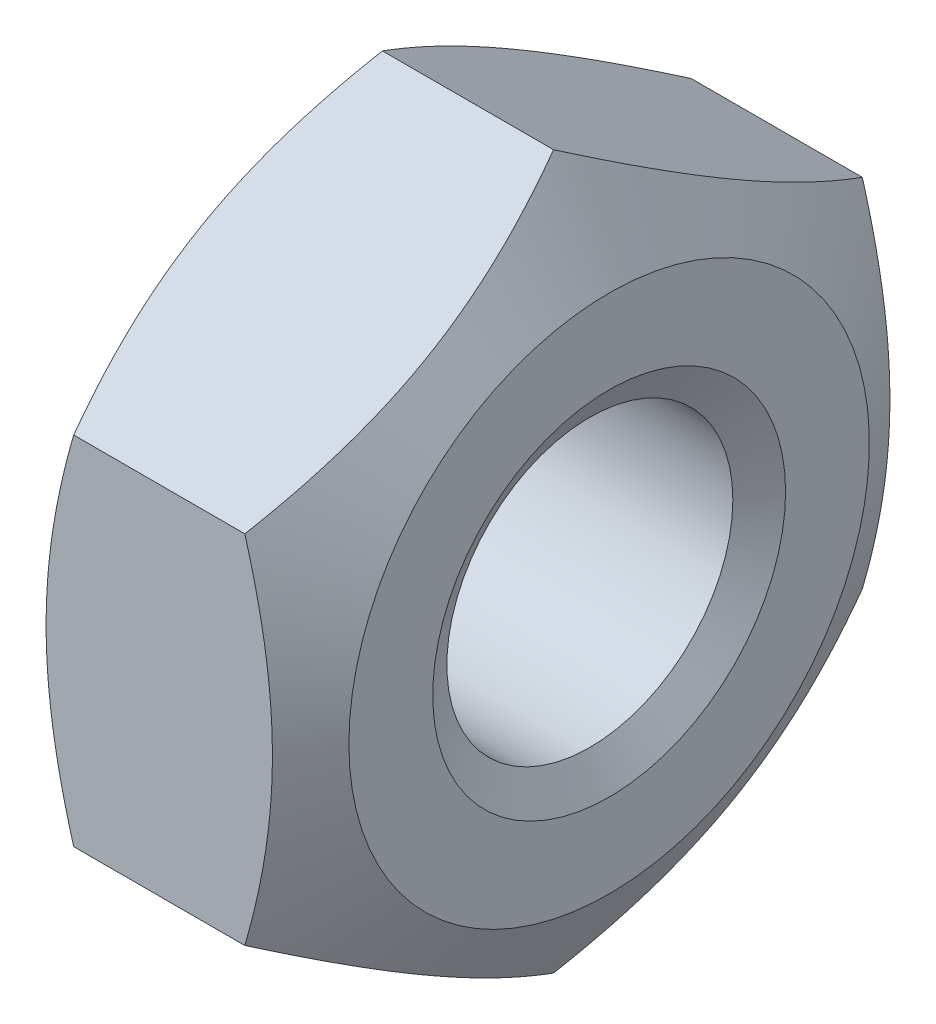
ISO-10303-21;
HEADER;
FILE_DESCRIPTION(('STEP AP214'),'2;1');
FILE_NAME('part.step','',(''),(''),'','','');
FILE_SCHEMA(('AUTOMOTIVE_DESIGN { 1 0 10303 214 1 1 1 1 }'));
ENDSEC;
DATA;
#1=APPLICATION_CONTEXT('core data for automotive mechanical design processes');
#2=APPLICATION_PROTOCOL_DEFINITION('international standard','automotive_design',2000,#1);
#3=PRODUCT_CONTEXT('',#1,'mechanical');
#4=PRODUCT('Part','Part','',(#3));
#5=PRODUCT_RELATED_PRODUCT_CATEGORY('part','',(#4));
#6=PRODUCT_DEFINITION_FORMATION('','',#4);
#7=PRODUCT_DEFINITION_CONTEXT('part definition',#1,'design');
#8=PRODUCT_DEFINITION('design','',#6,#7);
#9=PRODUCT_DEFINITION_SHAPE('','',#8);
#10=(LENGTH_UNIT() NAMED_UNIT(*) SI_UNIT(.MILLI.,.METRE.));
#11=(NAMED_UNIT(*) PLANE_ANGLE_UNIT() SI_UNIT($,.RADIAN.));
#12=(NAMED_UNIT(*) SI_UNIT($,.STERADIAN.) SOLID_ANGLE_UNIT());
#13=UNCERTAINTY_MEASURE_WITH_UNIT(LENGTH_MEASURE(1.E-05),#10,'distance_accuracy_value','');
#14=(GEOMETRIC_REPRESENTATION_CONTEXT(3) GLOBAL_UNCERTAINTY_ASSIGNED_CONTEXT((#13)) GLOBAL_UNIT_ASSIGNED_CONTEXT((#10,
#11,#12)) REPRESENTATION_CONTEXT('',''));
#15=CARTESIAN_POINT('',(0.,0.,0.));
#16=DIRECTION('',(0.,0.,1.));
#17=DIRECTION('',(1.,0.,0.));
#18=AXIS2_PLACEMENT_3D('',#15,#16,#17);
#19=CARTESIAN_POINT('',(0.,-2.02072594216368,-3.50000000000001));
#20=DIRECTION('',(0.,-0.866025403784438,-0.5));
#21=DIRECTION('',(0.,0.5,-0.866025403784438));
#22=AXIS2_PLACEMENT_3D('',#19,#20,#21);
#23=PLANE('',#22);
#24=CARTESIAN_POINT('',(2.56984994576707,-4.04145186339375,1.05714893325112E-08));
#25=CARTESIAN_POINT('',(2.62113275137817,-3.95265320968477,-0.153803799306676));
#26=CARTESIAN_POINT('',(2.66777177454814,-3.86308803877111,-0.308935238229022));
#27=CARTESIAN_POINT('',(2.74917878479123,-3.68240692851915,-0.621884110179808));
#28=CARTESIAN_POINT('',(2.78391797629248,-3.59128777985549,-0.779707101885269));
#29=CARTESIAN_POINT('',(2.83799203304816,-3.41017867858608,-1.0933972646342));
#30=CARTESIAN_POINT('',(2.85768683308025,-3.32021658408339,-1.2492161839238));
#31=CARTESIAN_POINT('',(2.88119391696435,-3.1398693140048,-1.56158681932785));
#32=CARTESIAN_POINT('',(2.88502567137971,-3.04948479349284,-1.7181374008396));
#33=CARTESIAN_POINT('',(2.87703395230341,-2.88061101310778,-2.01063536838706));
#34=CARTESIAN_POINT('',(2.86717271052631,-2.80209641232874,-2.14662664612187));
#35=CARTESIAN_POINT('',(2.83592468239256,-2.6455787077886,-2.41772326270602));
#36=CARTESIAN_POINT('',(2.81452723222056,-2.56757614497624,-2.55282766460459));
#37=CARTESIAN_POINT('',(2.7610377484211,-2.41073599913576,-2.82448276585615));
#38=CARTESIAN_POINT('',(2.72871908214741,-2.33191825633257,-2.96099910093186));
#39=CARTESIAN_POINT('',(2.65536937301066,-2.17545799734927,-3.23199621886171));
#40=CARTESIAN_POINT('',(2.61435555334474,-2.09781347827887,-3.36648047082358));
#41=CARTESIAN_POINT('',(2.56984995282612,-2.02072592849436,-3.50000002367597));
#42=B_SPLINE_CURVE_WITH_KNOTS('',3,(#24,#25,#26,#27,#28,#29,#30,#31,#32,#33,#34,#35,#36,#37,#38,
#39,#40,#41),.UNSPECIFIED.,.F.,.F.,(4,2,2,2,2,2,2,2,4),(0.,0.554778024534309,1.11088918796949,
1.65323832193879,2.19492156992558,2.66648863780462,3.13849236108732,3.62096286571907,
4.10248648455409),.UNSPECIFIED.);
#43=CARTESIAN_POINT('',(2.56984996751798,-4.04145187253727,2.04298632043957E-08));
#44=VERTEX_POINT('',#43);
#45=CARTESIAN_POINT('',(2.56984995591147,-2.02072593383833,-3.50000001441993));
#46=VERTEX_POINT('',#45);
#47=EDGE_CURVE('E166',#44,#46,#42,.T.);
#48=ORIENTED_EDGE('',*,*,#47,.F.);
#49=DIRECTION('',(1.,0.,0.));
#50=VECTOR('',#49,1.);
#51=CARTESIAN_POINT('',(0.,-4.04145188432738,0.));
#52=LINE('',#51,#50);
#53=CARTESIAN_POINT('',(0.630150032413201,-4.04145187252661,-2.04395361740782E-08));
#54=VERTEX_POINT('',#53);
#55=EDGE_CURVE('E85',#54,#44,#52,.T.);
#56=ORIENTED_EDGE('',*,*,#55,.F.);
#57=CARTESIAN_POINT('',(0.630150071500211,-2.02072589630917,-3.50000000444251));
#58=CARTESIAN_POINT('',(0.578867259454926,-2.10952458374514,-3.34619621420841));
#59=CARTESIAN_POINT('',(0.532228233087873,-2.19908976887821,-3.1910647826805));
#60=CARTESIAN_POINT('',(0.450821219384244,-2.37977089036047,-2.87811591475711));
#61=CARTESIAN_POINT('',(0.416082027621338,-2.47089003599309,-2.72029291965956));
#62=CARTESIAN_POINT('',(0.362007969716817,-2.6519991358757,-2.40660275316662));
#63=CARTESIAN_POINT('',(0.34231316880347,-2.74196123190636,-2.2507838334561));
#64=CARTESIAN_POINT('',(0.318806083532136,-2.92230850388836,-1.93841319637207));
#65=CARTESIAN_POINT('',(0.314974328613412,-3.01269302477729,-1.78186261360207));
#66=CARTESIAN_POINT('',(0.322966046770053,-3.18156680304943,-1.48936464933534));
#67=CARTESIAN_POINT('',(0.332827287616221,-3.26008140130181,-1.35337337610565));
#68=CARTESIAN_POINT('',(0.364075313204048,-3.41659910076434,-1.08227676841131));
#69=CARTESIAN_POINT('',(0.385472761757782,-3.49460166102586,-0.947172370897061));
#70=CARTESIAN_POINT('',(0.438962241754452,-3.65144180177822,-0.675517278430631));
#71=CARTESIAN_POINT('',(0.471280905828347,-3.73025954204663,-0.539000947752304));
#72=CARTESIAN_POINT('',(0.544630610221948,-3.88671979607203,-0.26800383842379));
#73=CARTESIAN_POINT('',(0.585644427348721,-3.96436431271875,-0.133519590666844));
#74=CARTESIAN_POINT('',(0.630150025240757,-4.04145186010357,-4.1956866337069E-08));
#75=B_SPLINE_CURVE_WITH_KNOTS('',3,(#57,#58,#59,#60,#61,#62,#63,#64,#65,#66,#67,#68,#69,#70,#71,
#72,#73,#74),.UNSPECIFIED.,.F.,.F.,(4,2,2,2,2,2,2,2,4),(0.,0.554778028980141,1.11088919663053,
1.65323833431585,2.19492158611914,2.66648863841361,3.13849234598863,3.62096283439448,
4.1024864372279),.UNSPECIFIED.);
#76=CARTESIAN_POINT('',(0.630150026728635,-2.02072589887021,-3.50000000000001));
#77=VERTEX_POINT('',#76);
#78=EDGE_CURVE('E167',#77,#54,#75,.T.);
#79=ORIENTED_EDGE('',*,*,#78,.F.);
#80=DIRECTION('',(1.,0.,0.));
#81=VECTOR('',#80,1.);
#82=CARTESIAN_POINT('',(0.,-2.02072594216368,-3.50000000000001));
#83=LINE('',#82,#81);
#84=EDGE_CURVE('E228',#46,#77,#83,.F.);
#85=ORIENTED_EDGE('',*,*,#84,.F.);
#86=EDGE_LOOP('',(#48,#56,#79,#85));
#87=FACE_BOUND('',#86,.T.);
#88=ADVANCED_FACE('F17',(#87),#23,.T.);
#89=CARTESIAN_POINT('',(0.,2.0207259421637,-3.5));
#90=DIRECTION('',(0.,0.,-1.));
#91=DIRECTION('',(0.,1.,0.));
#92=AXIS2_PLACEMENT_3D('',#89,#90,#91);
#93=PLANE('',#92);
#94=CARTESIAN_POINT('',(2.56984998572382,-2.02072585554136,-3.50000000000001));
#95=CARTESIAN_POINT('',(2.62113277969768,-1.84312852260271,-3.50000000000001));
#96=CARTESIAN_POINT('',(2.66777179656179,-1.6639981720095,-3.50000000000001));
#97=CARTESIAN_POINT('',(2.74917879900789,-1.30263594874545,-3.50000000000001));
#98=CARTESIAN_POINT('',(2.78391798902287,-1.12039765745821,-3.50000000000001));
#99=CARTESIAN_POINT('',(2.8379920418256,-0.758179462629587,-3.5));
#100=CARTESIAN_POINT('',(2.85768683938304,-0.57825527538245,-3.5));
#101=CARTESIAN_POINT('',(2.88119391899716,-0.217560740001899,-3.5));
#102=CARTESIAN_POINT('',(2.88502567162013,-0.0367917019951293,-3.5));
#103=CARTESIAN_POINT('',(2.87703394990615,0.300955841667768,-3.5));
#104=CARTESIAN_POINT('',(2.86717270813307,0.457985029141738,-3.5));
#105=CARTESIAN_POINT('',(2.83592468213315,0.771020410174695,-3.5));
#106=CARTESIAN_POINT('',(2.81452723409316,0.927025521836327,-3.5));
#107=CARTESIAN_POINT('',(2.76103775642913,1.24070578506775,-3.5));
#108=CARTESIAN_POINT('',(2.72871909423582,1.39834125620258,-3.5));
#109=CARTESIAN_POINT('',(2.65536939461378,1.71126174567405,-3.5));
#110=CARTESIAN_POINT('',(2.6143555803781,1.86655076979013,-3.5));
#111=CARTESIAN_POINT('',(2.56984998572662,2.02072585553168,-3.5));
#112=B_SPLINE_CURVE_WITH_KNOTS('',3,(#94,#95,#96,#97,#98,#99,#100,#101,#102,#103,#104,#105,#106,
#107,#108,#109,#110,#111),.UNSPECIFIED.,.F.,.F.,(4,2,2,2,2,2,2,2,4),(0.,0.554778014292563,
1.11088916777112,1.65323829337641,2.19492153287985,2.66648855857881,3.13849223963305,
3.62096269933189,4.10248627339904),.UNSPECIFIED.);
#113=CARTESIAN_POINT('',(2.56984997322236,2.02072589884769,-3.5));
#114=VERTEX_POINT('',#113);
#115=EDGE_CURVE('E142',#46,#114,#112,.T.);
#116=ORIENTED_EDGE('',*,*,#115,.F.);
#117=ORIENTED_EDGE('',*,*,#84,.T.);
#118=CARTESIAN_POINT('',(0.630150071507421,2.02072596895254,-3.49999996250535));
#119=CARTESIAN_POINT('',(0.578867259463394,1.84312863570585,-3.4999999865336));
#120=CARTESIAN_POINT('',(0.532228233098085,1.66399828252291,-3.49999999639078));
#121=CARTESIAN_POINT('',(0.450821219397429,1.30263605210071,-3.5000000036179));
#122=CARTESIAN_POINT('',(0.416082027635643,1.12039775624253,-3.50000000095777));
#123=CARTESIAN_POINT('',(0.362007969726331,0.758179553202127,-3.49999999906593));
#124=CARTESIAN_POINT('',(0.342313168809251,0.578255362314097,-3.49999999975101));
#125=CARTESIAN_POINT('',(0.318806083533229,0.217560819183361,-3.50000000024869));
#126=CARTESIAN_POINT('',(0.314974328613654,0.0367917770673135,-3.50000000006237));
#127=CARTESIAN_POINT('',(0.322966046692971,-0.300955776472625,-3.49999999994571));
#128=CARTESIAN_POINT('',(0.332827287209966,-0.457984969693767,-3.49999999998537));
#129=CARTESIAN_POINT('',(0.364075311686928,-0.771020362191637,-3.50000000001465));
#130=CARTESIAN_POINT('',(0.385472759457896,-0.927025479571331,-3.50000000000423));
#131=CARTESIAN_POINT('',(0.438962237502917,-1.24070575469492,-3.49999999999569));
#132=CARTESIAN_POINT('',(0.471280900393798,-1.3983412319966,-3.49999999999785));
#133=CARTESIAN_POINT('',(0.54463060216416,-1.71126173369475,-3.50000000000216));
#134=CARTESIAN_POINT('',(0.585644417852275,-1.86655076387023,-3.50000000000431));
#135=CARTESIAN_POINT('',(0.630150014230888,-2.02072585557675,-3.50000000000001));
#136=B_SPLINE_CURVE_WITH_KNOTS('',3,(#118,#119,#120,#121,#122,#123,#124,#125,#126,#127,#128,
#129,#130,#131,#132,#133,#134,#135),.UNSPECIFIED.,.F.,.F.,(4,2,2,2,2,2,2,2,4),(0.,
0.554778028943396,1.11088919655202,1.65323833427812,2.19492158612583,2.66648862876172,
3.1384923266424,3.6209628048506,4.10248639756405),.UNSPECIFIED.);
#137=CARTESIAN_POINT('',(0.630150026726456,2.0207259638142,-3.49999996250022));
#138=VERTEX_POINT('',#137);
#139=EDGE_CURVE('E98',#138,#77,#136,.T.);
#140=ORIENTED_EDGE('',*,*,#139,.F.);
#141=DIRECTION('',(1.,0.,0.));
#142=VECTOR('',#141,1.);
#143=CARTESIAN_POINT('',(0.,2.02072594216369,-3.5));
#144=LINE('',#143,#142);
#145=EDGE_CURVE('E230',#114,#138,#144,.F.);
#146=ORIENTED_EDGE('',*,*,#145,.F.);
#147=EDGE_LOOP('',(#116,#117,#140,#146));
#148=FACE_BOUND('',#147,.T.);
#149=ADVANCED_FACE('F178',(#148),#93,.T.);
#150=CARTESIAN_POINT('',(0.,4.04145188432738,0.));
#151=DIRECTION('',(0.,0.866025403784439,-0.499999999999999));
#152=DIRECTION('',(0.,0.499999999999999,0.866025403784439));
#153=AXIS2_PLACEMENT_3D('',#150,#151,#152);
#154=PLANE('',#153);
#155=CARTESIAN_POINT('',(2.56984992844359,2.02072589630879,-3.50000000443717));
#156=CARTESIAN_POINT('',(2.62113274048647,2.10952458374013,-3.34619621421495));
#157=CARTESIAN_POINT('',(2.667771766851,2.19908976886759,-3.19106478269832));
#158=CARTESIAN_POINT('',(2.74917878055043,2.37977089033686,-2.8781159147986));
#159=CARTESIAN_POINT('',(2.78391797231177,2.47089003596208,-2.72029291971344));
#160=CARTESIAN_POINT('',(2.83799203022013,2.65199913584354,-2.40660275322218));
#161=CARTESIAN_POINT('',(2.8576868311367,2.74196123188062,-2.25078383350065));
#162=CARTESIAN_POINT('',(2.88119391641177,2.92230850387655,-1.93841319639257));
#163=CARTESIAN_POINT('',(2.88502567133091,3.012693024773,-1.78186261360952));
#164=CARTESIAN_POINT('',(2.87703395325095,3.18156680143942,-1.48936465212395));
#165=CARTESIAN_POINT('',(2.86717271273407,3.26008139808204,-1.35337338168247));
#166=CARTESIAN_POINT('',(2.83592468825802,3.41659909435176,-1.08227677951824));
#167=CARTESIAN_POINT('',(2.81452724048785,3.49460165303031,-0.947172384745772));
#168=CARTESIAN_POINT('',(2.76103776244501,3.6514417905801,-0.675517297826358));
#169=CARTESIAN_POINT('',(2.72871909955554,3.73025952923048,-0.539000969950542));
#170=CARTESIAN_POINT('',(2.65536939778842,3.88671978007869,-0.268003866125078));
#171=CARTESIAN_POINT('',(2.61435558210213,3.96436429516604,-0.13351962106904));
#172=CARTESIAN_POINT('',(2.56984998572548,4.04145184101335,-7.50220958486925E-08));
#173=B_SPLINE_CURVE_WITH_KNOTS('',3,(#155,#156,#157,#158,#159,#160,#161,#162,#163,#164,#165,
#166,#167,#168,#169,#170,#171,#172),.UNSPECIFIED.,.F.,.F.,(4,2,2,2,2,2,2,2,4),(0.,
0.554778028941774,1.11088919654877,1.65323833427351,2.19492158611985,2.666488628742,
3.13849232660889,3.62096280480255,4.10248639750154),.UNSPECIFIED.);
#174=CARTESIAN_POINT('',(2.56984997322179,4.04145186267037,-3.75110474715879E-08));
#175=VERTEX_POINT('',#174);
#176=EDGE_CURVE('E125',#114,#175,#173,.T.);
#177=ORIENTED_EDGE('',*,*,#176,.F.);
#178=ORIENTED_EDGE('',*,*,#145,.T.);
#179=CARTESIAN_POINT('',(0.630150071504561,4.04145186524928,4.1941312770487E-08));
#180=CARTESIAN_POINT('',(0.578867259461438,3.95265321943398,-0.153803772308202));
#181=CARTESIAN_POINT('',(0.532228233096604,3.86308805137872,-0.308935213681728));
#182=CARTESIAN_POINT('',(0.450821219396511,3.68240694242635,-0.621884088808623));
#183=CARTESIAN_POINT('',(0.416082027634813,3.59128779219376,-0.77970708123399));
#184=CARTESIAN_POINT('',(0.362007969725754,3.41017868903547,-1.0933972458339));
#185=CARTESIAN_POINT('',(0.34231316880884,3.3202165941848,-1.24921616624066));
#186=CARTESIAN_POINT('',(0.318806083533099,3.13986932305061,-1.5615868038468));
#187=CARTESIAN_POINT('',(0.314974328613638,3.04948480183133,-1.71813738644375));
#188=CARTESIAN_POINT('',(0.322966046693105,2.88061102496122,-2.01063534781553));
#189=CARTESIAN_POINT('',(0.332827287210033,2.80209642838577,-2.1466266182993));
#190=CARTESIAN_POINT('',(0.364075311686632,2.64557873216374,-2.41772322049804));
#191=CARTESIAN_POINT('',(0.385472759457303,2.56757617346563,-2.55282761526269));
#192=CARTESIAN_POINT('',(0.438962237501533,2.410736035898,-2.82448270217884));
#193=CARTESIAN_POINT('',(0.471280900391912,2.33191829724983,-2.96099903005948));
#194=CARTESIAN_POINT('',(0.544630602161129,2.17545804640605,-3.2319961338945));
#195=CARTESIAN_POINT('',(0.585644417848602,2.09781353132094,-3.36648037895526));
#196=CARTESIAN_POINT('',(0.630150014226531,2.02072598546471,-3.49999992500044));
#197=B_SPLINE_CURVE_WITH_KNOTS('',3,(#179,#180,#181,#182,#183,#184,#185,#186,#187,#188,#189,
#190,#191,#192,#193,#194,#195,#196),.UNSPECIFIED.,.F.,.F.,(4,2,2,2,2,2,2,2,4),(0.,
0.554778028942649,1.11088919655055,1.65323833427606,2.19492158612317,2.66648862875439,
3.1384923266304,3.62096280483365,4.10248639754216),.UNSPECIFIED.);
#198=CARTESIAN_POINT('',(0.63015002672732,4.04145186267837,3.74971871916652E-08));
#199=VERTEX_POINT('',#198);
#200=EDGE_CURVE('E97',#199,#138,#197,.T.);
#201=ORIENTED_EDGE('',*,*,#200,.F.);
#202=DIRECTION('',(1.,0.,0.));
#203=VECTOR('',#202,1.);
#204=CARTESIAN_POINT('',(0.,4.04145188432738,0.));
#205=LINE('',#204,#203);
#206=EDGE_CURVE('E86',#175,#199,#205,.F.);
#207=ORIENTED_EDGE('',*,*,#206,.F.);
#208=EDGE_LOOP('',(#177,#178,#201,#207));
#209=FACE_BOUND('',#208,.T.);
#210=ADVANCED_FACE('F114',(#209),#154,.T.);
#211=CARTESIAN_POINT('',(0.,2.02072594216369,3.5));
#212=DIRECTION('',(0.,0.866025403784438,0.5));
#213=DIRECTION('',(0.,-0.5,0.866025403784438));
#214=AXIS2_PLACEMENT_3D('',#211,#212,#213);
#215=PLANE('',#214);
#216=CARTESIAN_POINT('',(2.56984992844548,4.04145186524183,-4.19262408021453E-08));
#217=CARTESIAN_POINT('',(2.62113274048776,3.95265321942605,0.153803772322722));
#218=CARTESIAN_POINT('',(2.66777176685198,3.86308805137069,0.308935213695841));
#219=CARTESIAN_POINT('',(2.74917878055104,3.68240694241849,0.621884088822035));
#220=CARTESIAN_POINT('',(2.78391797231233,3.59128779218616,0.779707081247106));
#221=CARTESIAN_POINT('',(2.83799203022052,3.41017868902828,1.09339724584641));
#222=CARTESIAN_POINT('',(2.85768683113698,3.32021659417777,1.24921616625286));
#223=CARTESIAN_POINT('',(2.88119391641186,3.13986932304392,1.56158680385837));
#224=CARTESIAN_POINT('',(2.88502567133092,3.04948480182484,1.71813738645498));
#225=CARTESIAN_POINT('',(2.87703395325082,2.88061102495618,2.01063534782426));
#226=CARTESIAN_POINT('',(2.86717271273383,2.80209642838198,2.14662661830586));
#227=CARTESIAN_POINT('',(2.83592468825747,2.64557873216243,2.41772322050031));
#228=CARTESIAN_POINT('',(2.81452724048711,2.56757617346556,2.55282761526282));
#229=CARTESIAN_POINT('',(2.76103776244384,2.41073603590044,2.82448270217462));
#230=CARTESIAN_POINT('',(2.72871909955413,2.33191829725354,2.96099903005306));
#231=CARTESIAN_POINT('',(2.65536939778647,2.17545804641226,3.23199613388373));
#232=CARTESIAN_POINT('',(2.61435558209991,2.09781353132838,3.36648037894236));
#233=CARTESIAN_POINT('',(2.56984998572296,2.02072598547336,3.49999992498544));
#234=B_SPLINE_CURVE_WITH_KNOTS('',3,(#216,#217,#218,#219,#220,#221,#222,#223,#224,#225,#226,
#227,#228,#229,#230,#231,#232,#233),.UNSPECIFIED.,.F.,.F.,(4,2,2,2,2,2,2,2,4),(0.,
0.554778028941298,1.11088919654784,1.65323833427217,2.1949215861181,2.66648862874189,
3.13849232661044,3.62096280480582,4.10248639750651),.UNSPECIFIED.);
#235=CARTESIAN_POINT('',(2.56984997322054,2.02072596381853,3.49999996249272));
#236=VERTEX_POINT('',#235);
#237=EDGE_CURVE('E119',#175,#236,#234,.T.);
#238=ORIENTED_EDGE('',*,*,#237,.F.);
#239=ORIENTED_EDGE('',*,*,#206,.T.);
#240=CARTESIAN_POINT('',(0.630150071502064,2.02072589630988,3.50000000441208));
#241=CARTESIAN_POINT('',(0.578867259454948,2.10952458374724,3.34619621419431));
#242=CARTESIAN_POINT('',(0.532228233088914,2.19908976887727,3.19106478267933));
#243=CARTESIAN_POINT('',(0.450821219388989,2.37977089034859,2.87811591478052));
#244=CARTESIAN_POINT('',(0.416082027628657,2.47089003597329,2.72029291969462));
#245=CARTESIAN_POINT('',(0.362007969721795,2.65199913585446,2.40660275320268));
#246=CARTESIAN_POINT('',(0.34231316880572,2.74196123189176,2.2507838334812));
#247=CARTESIAN_POINT('',(0.318806083531853,2.92230850388791,1.93841319637305));
#248=CARTESIAN_POINT('',(0.314974328613433,3.01269302478435,1.78186261358989));
#249=CARTESIAN_POINT('',(0.322966046694696,3.18156680145118,1.48936465210354));
#250=CARTESIAN_POINT('',(0.332827287212233,3.2600813980942,1.35337338166139));
#251=CARTESIAN_POINT('',(0.36407531168967,3.41659909436469,1.08227677949585));
#252=CARTESIAN_POINT('',(0.385472759460567,3.4946016530436,0.947172384722755));
#253=CARTESIAN_POINT('',(0.438962237504896,3.65144179059415,0.675517297802024));
#254=CARTESIAN_POINT('',(0.471280900395138,3.73025952924492,0.539000969925522));
#255=CARTESIAN_POINT('',(0.5446306021638,3.88671978009392,0.268003866098699));
#256=CARTESIAN_POINT('',(0.585644417850854,3.96436429518166,0.133519621041987));
#257=CARTESIAN_POINT('',(0.630150014228258,4.04145184102936,7.49943735298503E-08));
#258=B_SPLINE_CURVE_WITH_KNOTS('',3,(#240,#241,#242,#243,#244,#245,#246,#247,#248,#249,#250,
#251,#252,#253,#254,#255,#256,#257),.UNSPECIFIED.,.F.,.F.,(4,2,2,2,2,2,2,2,4),(0.,
0.554778028942468,1.1108891965499,1.65323833427475,2.1949215861213,2.66648862874594,
3.13849232661527,3.62096280481172,4.10248639751357),.UNSPECIFIED.);
#259=CARTESIAN_POINT('',(0.630150026725827,2.0207258988605,3.5));
#260=VERTEX_POINT('',#259);
#261=EDGE_CURVE('E92',#260,#199,#258,.T.);
#262=ORIENTED_EDGE('',*,*,#261,.F.);
#263=DIRECTION('',(1.,0.,0.));
#264=VECTOR('',#263,1.);
#265=CARTESIAN_POINT('',(0.,2.02072594216369,3.5));
#266=LINE('',#265,#264);
#267=EDGE_CURVE('E79',#236,#260,#266,.F.);
#268=ORIENTED_EDGE('',*,*,#267,.F.);
#269=EDGE_LOOP('',(#238,#239,#262,#268));
#270=FACE_BOUND('',#269,.T.);
#271=ADVANCED_FACE('F95',(#270),#215,.T.);
#272=CARTESIAN_POINT('',(0.,-2.02072594216369,3.5));
#273=DIRECTION('',(0.,0.,1.));
#274=DIRECTION('',(1.,0.,0.));
#275=AXIS2_PLACEMENT_3D('',#272,#273,#274);
#276=PLANE('',#275);
#277=CARTESIAN_POINT('',(2.56984992844964,2.02072596892187,3.49999996251103));
#278=CARTESIAN_POINT('',(2.62113274049061,1.84312863567545,3.49999998653564));
#279=CARTESIAN_POINT('',(2.66777176685415,1.66399828249313,3.49999999639133));
#280=CARTESIAN_POINT('',(2.74917878055239,1.30263605207248,3.50000000361735));
#281=CARTESIAN_POINT('',(2.78391797231355,1.12039775621525,3.50000000095762));
#282=CARTESIAN_POINT('',(2.83799203022137,0.75817955317658,3.49999999906607));
#283=CARTESIAN_POINT('',(2.85768683113758,0.578255362289346,3.49999999975104));
#284=CARTESIAN_POINT('',(2.88119391641205,0.217560819160301,3.50000000024865));
#285=CARTESIAN_POINT('',(2.88502567133094,0.0367917770451484,3.50000000006235));
#286=CARTESIAN_POINT('',(2.87703395325052,-0.300955776491889,3.49999999994572));
#287=CARTESIAN_POINT('',(2.86717271273318,-0.457984969711032,3.49999999998537));
#288=CARTESIAN_POINT('',(2.83592468825586,-0.771020362204911,3.50000000001464));
#289=CARTESIAN_POINT('',(2.81452724048488,-0.927025479582612,3.50000000000422));
#290=CARTESIAN_POINT('',(2.76103776244014,-1.24070575470211,3.49999999999568));
#291=CARTESIAN_POINT('',(2.72871909954956,-1.3983412320017,3.49999999999784));
#292=CARTESIAN_POINT('',(2.65536939778005,-1.7112617336957,3.50000000000215));
#293=CARTESIAN_POINT('',(2.61435558209248,-1.86655076386914,3.5000000000043));
#294=CARTESIAN_POINT('',(2.5698499857145,-2.02072585557365,3.5));
#295=B_SPLINE_CURVE_WITH_KNOTS('',3,(#277,#278,#279,#280,#281,#282,#283,#284,#285,#286,#287,
#288,#289,#290,#291,#292,#293,#294),.UNSPECIFIED.,.F.,.F.,(4,2,2,2,2,2,2,2,4),(0.,
0.554778028940264,1.11088919654581,1.65323833426923,2.19492158611423,2.66648862874422,
3.138492326619,3.62096280482087,4.10248639752799),.UNSPECIFIED.);
#296=CARTESIAN_POINT('',(2.56984997321631,-2.02072589886867,3.5));
#297=VERTEX_POINT('',#296);
#298=EDGE_CURVE('E41',#236,#297,#295,.T.);
#299=ORIENTED_EDGE('',*,*,#298,.F.);
#300=ORIENTED_EDGE('',*,*,#267,.T.);
#301=CARTESIAN_POINT('',(0.630150014229783,-2.02072585555403,3.49999999999166));
#302=CARTESIAN_POINT('',(0.578867220252204,-1.84312852261551,3.49999999999701));
#303=CARTESIAN_POINT('',(0.532228203386295,-1.66399817202193,3.4999999999992));
#304=CARTESIAN_POINT('',(0.450821200938344,-1.30263594875671,3.5000000000008));
#305=CARTESIAN_POINT('',(0.416082010923311,-1.12039765746867,3.50000000000021));
#306=CARTESIAN_POINT('',(0.362007958120123,-0.758179462638681,3.49999999999979));
#307=CARTESIAN_POINT('',(0.342313160562267,-0.578255275390971,3.49999999999994));
#308=CARTESIAN_POINT('',(0.318806080947538,-0.217560740009197,3.50000000000006));
#309=CARTESIAN_POINT('',(0.314974328324368,-0.0367917020017787,3.50000000000001));
#310=CARTESIAN_POINT('',(0.322966050038113,0.300955841664285,3.49999999999999));
#311=CARTESIAN_POINT('',(0.33282729181129,0.457985029140767,3.5));
#312=CARTESIAN_POINT('',(0.364075317811772,0.771020410178706,3.5));
#313=CARTESIAN_POINT('',(0.385472765852239,0.927025521842807,3.5));
#314=CARTESIAN_POINT('',(0.438962243517535,1.24070578507929,3.5));
#315=CARTESIAN_POINT('',(0.47128090571165,1.3983412562167,3.5));
#316=CARTESIAN_POINT('',(0.544630605335549,1.71126174569327,3.5));
#317=CARTESIAN_POINT('',(0.585644419572271,1.86655076981187,3.5));
#318=CARTESIAN_POINT('',(0.630150014224864,2.02072585555589,3.5));
#319=B_SPLINE_CURVE_WITH_KNOTS('',3,(#301,#302,#303,#304,#305,#306,#307,#308,#309,#310,#311,
#312,#313,#314,#315,#316,#317,#318),.UNSPECIFIED.,.F.,.F.,(4,2,2,2,2,2,2,2,4),(0.,
0.554778014294998,1.11088916777585,1.65323829338303,2.1949215328884,2.66648855859488,
3.13849223965663,3.62096269936355,4.10248627343878),.UNSPECIFIED.);
#320=CARTESIAN_POINT('',(0.630150044031763,-2.02072593384053,3.50000001441614));
#321=VERTEX_POINT('',#320);
#322=EDGE_CURVE('E21',#321,#260,#319,.T.);
#323=ORIENTED_EDGE('',*,*,#322,.F.);
#324=DIRECTION('',(1.,0.,0.));
#325=VECTOR('',#324,1.);
#326=CARTESIAN_POINT('',(0.,-2.02072594216369,3.5));
#327=LINE('',#326,#325);
#328=EDGE_CURVE('E73',#297,#321,#327,.F.);
#329=ORIENTED_EDGE('',*,*,#328,.F.);
#330=EDGE_LOOP('',(#299,#300,#323,#329));
#331=FACE_BOUND('',#330,.T.);
#332=ADVANCED_FACE('F81',(#331),#276,.T.);
#333=CARTESIAN_POINT('',(0.,-4.04145188432738,0.));
#334=DIRECTION('',(0.,-0.866025403784439,0.5));
#335=DIRECTION('',(0.,-0.5,-0.866025403784439));
#336=AXIS2_PLACEMENT_3D('',#333,#334,#335);
#337=PLANE('',#336);
#338=CARTESIAN_POINT('',(2.5698499284562,-2.02072589632483,3.50000000445267));
#339=CARTESIAN_POINT('',(2.62113274049386,-2.10952458375086,3.34619621421191));
#340=CARTESIAN_POINT('',(2.66777176685763,-2.19908976887953,3.19106478268182));
#341=CARTESIAN_POINT('',(2.74917878055866,-2.3797708903579,2.87811591475797));
#342=CARTESIAN_POINT('',(2.78391797232225,-2.47089003599107,2.72029291966213));
#343=CARTESIAN_POINT('',(2.8379920302273,-2.65199913587349,2.40660275317138));
#344=CARTESIAN_POINT('',(2.85768683114051,-2.74196123190347,2.25078383346136));
#345=CARTESIAN_POINT('',(2.88119391641198,-2.92230850388442,1.93841319637865));
#346=CARTESIAN_POINT('',(2.88502567133098,-3.01269302477299,1.78186261360947));
#347=CARTESIAN_POINT('',(2.87703395317485,-3.18156680304631,1.48936464934079));
#348=CARTESIAN_POINT('',(2.86717271232859,-3.26008140130026,1.35337337610837));
#349=CARTESIAN_POINT('',(2.83592468674013,-3.41659910076591,1.08227676840858));
#350=CARTESIAN_POINT('',(2.81452723818585,-3.494601661029,0.947172370891625));
#351=CARTESIAN_POINT('',(2.76103775818769,-3.65144180178448,0.675517278419807));
#352=CARTESIAN_POINT('',(2.72871909411286,-3.73025954205443,0.539000947738803));
#353=CARTESIAN_POINT('',(2.65536938971711,-3.88671979608285,0.268003838405067));
#354=CARTESIAN_POINT('',(2.61435557258913,-3.96436431273103,0.133519590645574));
#355=CARTESIAN_POINT('',(2.56984997469581,-4.0414518601173,4.19330874560692E-08));
#356=B_SPLINE_CURVE_WITH_KNOTS('',3,(#338,#339,#340,#341,#342,#343,#344,#345,#346,#347,#348,
#349,#350,#351,#352,#353,#354,#355),.UNSPECIFIED.,.F.,.F.,(4,2,2,2,2,2,2,2,4),(0.,
0.554778028976753,1.11088919662412,1.65323833430699,2.1949215861077,2.66648863841156,
3.13849234599609,3.62096283441158,4.10248643725443),.UNSPECIFIED.);
#357=EDGE_CURVE('E149',#297,#44,#356,.T.);
#358=ORIENTED_EDGE('',*,*,#357,.F.);
#359=ORIENTED_EDGE('',*,*,#328,.T.);
#360=CARTESIAN_POINT('',(0.630150054191998,-4.04145186335258,-1.05665896717194E-08));
#361=CARTESIAN_POINT('',(0.578867248567856,-3.95265320966294,0.153803799320653));
#362=CARTESIAN_POINT('',(0.53222822539261,-3.86308803875673,0.308935238247541));
#363=CARTESIAN_POINT('',(0.450821215146089,-3.68240692850933,0.621884110203222));
#364=CARTESIAN_POINT('',(0.416082023646677,-3.59128777984276,0.779707101909023));
#365=CARTESIAN_POINT('',(0.362007966893184,-3.41017867857054,1.09339726465945));
#366=CARTESIAN_POINT('',(0.342313166861461,-3.32021658406791,1.24921618395017));
#367=CARTESIAN_POINT('',(0.318806082978796,-3.13986931398868,1.56158681935622));
#368=CARTESIAN_POINT('',(0.314974328564517,-3.04948479347602,1.71813740086885));
#369=CARTESIAN_POINT('',(0.322966047642741,-2.88061101309229,2.0106353684138));
#370=CARTESIAN_POINT('',(0.33282728942032,-2.80209641231523,2.14662664614524));
#371=CARTESIAN_POINT('',(0.364075317554408,-2.64557870777904,2.41772326272261));
#372=CARTESIAN_POINT('',(0.38547276772627,-2.56757614496864,2.55282766461776));
#373=CARTESIAN_POINT('',(0.438962251524918,-2.41073599913205,2.82448276586257));
#374=CARTESIAN_POINT('',(0.471280917797925,-2.33191825633079,2.96099910093495));
#375=CARTESIAN_POINT('',(0.544630626932911,-2.17545799735123,3.23199621885832));
#376=CARTESIAN_POINT('',(0.585644446597755,-2.09781347828266,3.36648047081703));
#377=CARTESIAN_POINT('',(0.630150047115148,-2.02072592849995,3.5000000236663));
#378=B_SPLINE_CURVE_WITH_KNOTS('',3,(#360,#361,#362,#363,#364,#365,#366,#367,#368,#369,#370,
#371,#372,#373,#374,#375,#376,#377),.UNSPECIFIED.,.F.,.F.,(4,2,2,2,2,2,2,2,4),(0.,
0.554778024538823,1.11088918797783,1.65323832195,2.19492156993992,2.66648863780743,
3.13849236107838,3.62096286569844,4.10248648452207),.UNSPECIFIED.);
#379=EDGE_CURVE('E94',#54,#321,#378,.T.);
#380=ORIENTED_EDGE('',*,*,#379,.F.);
#381=ORIENTED_EDGE('',*,*,#55,.T.);
#382=EDGE_LOOP('',(#358,#359,#380,#381));
#383=FACE_BOUND('',#382,.T.);
#384=ADVANCED_FACE('F157',(#383),#337,.T.);
#385=CARTESIAN_POINT('',(0.633930939386573,0.,0.));
#386=DIRECTION('',(1.,0.,0.));
#387=DIRECTION('',(0.,0.,-1.));
#388=AXIS2_PLACEMENT_3D('',#385,#386,#387);
#389=CONICAL_SURFACE('',#388,4.04800059550325,1.04719755120157);
#390=CARTESIAN_POINT('',(8.79363856037818E-12,0.,0.));
#391=DIRECTION('',(1.,0.,0.));
#392=DIRECTION('',(0.,0.,-1.));
#393=AXIS2_PLACEMENT_3D('',#390,#391,#392);
#394=CIRCLE('',#393,2.94999999999845);
#395=CARTESIAN_POINT('',(8.79363856037818E-12,0.,-2.94999999999845));
#396=VERTEX_POINT('',#395);
#397=EDGE_CURVE('E155',#396,#396,#394,.T.);
#398=ORIENTED_EDGE('',*,*,#397,.T.);
#399=EDGE_LOOP('',(#398));
#400=FACE_BOUND('',#399,.T.);
#401=ORIENTED_EDGE('',*,*,#78,.T.);
#402=ORIENTED_EDGE('',*,*,#379,.T.);
#403=ORIENTED_EDGE('',*,*,#322,.T.);
#404=ORIENTED_EDGE('',*,*,#261,.T.);
#405=ORIENTED_EDGE('',*,*,#200,.T.);
#406=ORIENTED_EDGE('',*,*,#139,.T.);
#407=EDGE_LOOP('',(#401,#402,#403,#404,#405,#406));
#408=FACE_BOUND('',#407,.T.);
#409=ADVANCED_FACE('F90',(#400,#408),#389,.T.);
#410=CARTESIAN_POINT('',(2.56606906049228,0.,0.));
#411=DIRECTION('',(-1.,0.,0.));
#412=DIRECTION('',(0.,0.,1.));
#413=AXIS2_PLACEMENT_3D('',#410,#411,#412);
#414=CONICAL_SURFACE('',#413,4.04800059561694,1.04719755120157);
#415=ORIENTED_EDGE('',*,*,#357,.T.);
#416=ORIENTED_EDGE('',*,*,#47,.T.);
#417=ORIENTED_EDGE('',*,*,#115,.T.);
#418=ORIENTED_EDGE('',*,*,#176,.T.);
#419=ORIENTED_EDGE('',*,*,#237,.T.);
#420=ORIENTED_EDGE('',*,*,#298,.T.);
#421=EDGE_LOOP('',(#415,#416,#417,#418,#419,#420));
#422=FACE_BOUND('',#421,.T.);
#423=CARTESIAN_POINT('',(3.1999999999357,0.,0.));
#424=DIRECTION('',(-1.,0.,0.));
#425=DIRECTION('',(0.,0.,1.));
#426=AXIS2_PLACEMENT_3D('',#423,#424,#425);
#427=CIRCLE('',#426,2.94999999999845);
#428=CARTESIAN_POINT('',(3.1999999999357,0.,2.94999999999845));
#429=VERTEX_POINT('',#428);
#430=EDGE_CURVE('E220',#429,#429,#427,.F.);
#431=ORIENTED_EDGE('',*,*,#430,.F.);
#432=EDGE_LOOP('',(#431));
#433=FACE_BOUND('',#432,.T.);
#434=ADVANCED_FACE('F134',(#422,#433),#414,.T.);
#435=CARTESIAN_POINT('',(0.,0.,0.));
#436=DIRECTION('',(1.,0.,0.));
#437=DIRECTION('',(0.,0.,-1.));
#438=AXIS2_PLACEMENT_3D('',#435,#436,#437);
#439=PLANE('',#438);
#440=CARTESIAN_POINT('',(1.52311481822252E-11,0.,0.));
#441=DIRECTION('',(-1.,0.,0.));
#442=DIRECTION('',(0.,0.,1.));
#443=AXIS2_PLACEMENT_3D('',#440,#441,#442);
#444=CIRCLE('',#443,1.99988611410618);
#445=CARTESIAN_POINT('',(1.52311481822252E-11,0.,1.99988611410618));
#446=VERTEX_POINT('',#445);
#447=EDGE_CURVE('E222',#446,#446,#444,.F.);
#448=ORIENTED_EDGE('',*,*,#447,.T.);
#449=EDGE_LOOP('',(#448));
#450=FACE_BOUND('',#449,.T.);
#451=ORIENTED_EDGE('',*,*,#397,.F.);
#452=EDGE_LOOP('',(#451));
#453=FACE_BOUND('',#452,.T.);
#454=ADVANCED_FACE('F138',(#450,#453),#439,.F.);
#455=CARTESIAN_POINT('',(3.2,0.,0.));
#456=DIRECTION('',(1.,0.,0.));
#457=DIRECTION('',(0.,0.,-1.));
#458=AXIS2_PLACEMENT_3D('',#455,#456,#457);
#459=PLANE('',#458);
#460=CARTESIAN_POINT('',(3.20000000004059,0.,0.));
#461=DIRECTION('',(1.,0.,0.));
#462=DIRECTION('',(0.,0.,-1.));
#463=AXIS2_PLACEMENT_3D('',#460,#461,#462);
#464=CIRCLE('',#463,1.99988611416302);
#465=CARTESIAN_POINT('',(3.20000000004059,0.,-1.99988611416302));
#466=VERTEX_POINT('',#465);
#467=EDGE_CURVE('E217',#466,#466,#464,.F.);
#468=ORIENTED_EDGE('',*,*,#467,.T.);
#469=EDGE_LOOP('',(#468));
#470=FACE_BOUND('',#469,.T.);
#471=ORIENTED_EDGE('',*,*,#430,.T.);
#472=EDGE_LOOP('',(#471));
#473=FACE_BOUND('',#472,.T.);
#474=ADVANCED_FACE('F206',(#470,#473),#459,.T.);
#475=CARTESIAN_POINT('',(1.13686837721616E-10,0.,0.));
#476=DIRECTION('',(-1.,0.,0.));
#477=DIRECTION('',(0.,0.,1.));
#478=AXIS2_PLACEMENT_3D('',#475,#476,#477);
#479=CONICAL_SURFACE('',#478,1.99988611393564,1.04719755121176);
#480=CARTESIAN_POINT('',(0.21875,0.,0.));
#481=DIRECTION('',(1.,0.,0.));
#482=DIRECTION('',(0.,0.,-1.));
#483=AXIS2_PLACEMENT_3D('',#480,#481,#482);
#484=CIRCLE('',#483,1.621);
#485=CARTESIAN_POINT('',(0.21875,0.,-1.621));
#486=VERTEX_POINT('',#485);
#487=EDGE_CURVE('E32',#486,#486,#484,.T.);
#488=ORIENTED_EDGE('',*,*,#487,.T.);
#489=EDGE_LOOP('',(#488));
#490=FACE_BOUND('',#489,.T.);
#491=ORIENTED_EDGE('',*,*,#447,.F.);
#492=EDGE_LOOP('',(#491));
#493=FACE_BOUND('',#492,.T.);
#494=ADVANCED_FACE('F199',(#490,#493),#479,.F.);
#495=CARTESIAN_POINT('',(3.20000000010623,0.,0.));
#496=DIRECTION('',(1.,0.,0.));
#497=DIRECTION('',(0.,0.,-1.));
#498=AXIS2_PLACEMENT_3D('',#495,#496,#497);
#499=CONICAL_SURFACE('',#498,1.99988611427671,1.04719755124657);
#500=CARTESIAN_POINT('',(2.98125,0.,0.));
#501=DIRECTION('',(1.,0.,0.));
#502=DIRECTION('',(0.,0.,-1.));
#503=AXIS2_PLACEMENT_3D('',#500,#501,#502);
#504=CIRCLE('',#503,1.621);
#505=CARTESIAN_POINT('',(2.98125,0.,-1.621));
#506=VERTEX_POINT('',#505);
#507=EDGE_CURVE('E11',#506,#506,#504,.F.);
#508=ORIENTED_EDGE('',*,*,#507,.T.);
#509=EDGE_LOOP('',(#508));
#510=FACE_BOUND('',#509,.T.);
#511=ORIENTED_EDGE('',*,*,#467,.F.);
#512=EDGE_LOOP('',(#511));
#513=FACE_BOUND('',#512,.T.);
#514=ADVANCED_FACE('F193',(#510,#513),#499,.F.);
#515=CARTESIAN_POINT('',(-7.96124246369255,0.,0.));
#516=DIRECTION('',(1.,0.,0.));
#517=DIRECTION('',(0.,0.,-1.));
#518=AXIS2_PLACEMENT_3D('',#515,#516,#517);
#519=CYLINDRICAL_SURFACE('',#518,1.621);
#520=ORIENTED_EDGE('',*,*,#487,.F.);
#521=EDGE_LOOP('',(#520));
#522=FACE_BOUND('',#521,.T.);
#523=ORIENTED_EDGE('',*,*,#507,.F.);
#524=EDGE_LOOP('',(#523));
#525=FACE_BOUND('',#524,.T.);
#526=ADVANCED_FACE('F191',(#522,#525),#519,.F.);
#527=CLOSED_SHELL('',(#88,#149,#210,#271,#332,#384,#409,#434,#454,#474,#494,#514,#526));
#528=MANIFOLD_SOLID_BREP('B1',#527);
#529=ADVANCED_BREP_SHAPE_REPRESENTATION('',(#18,#528),#14);
#530=SHAPE_DEFINITION_REPRESENTATION(#9,#529);
ENDSEC;
END-ISO-10303-21;
